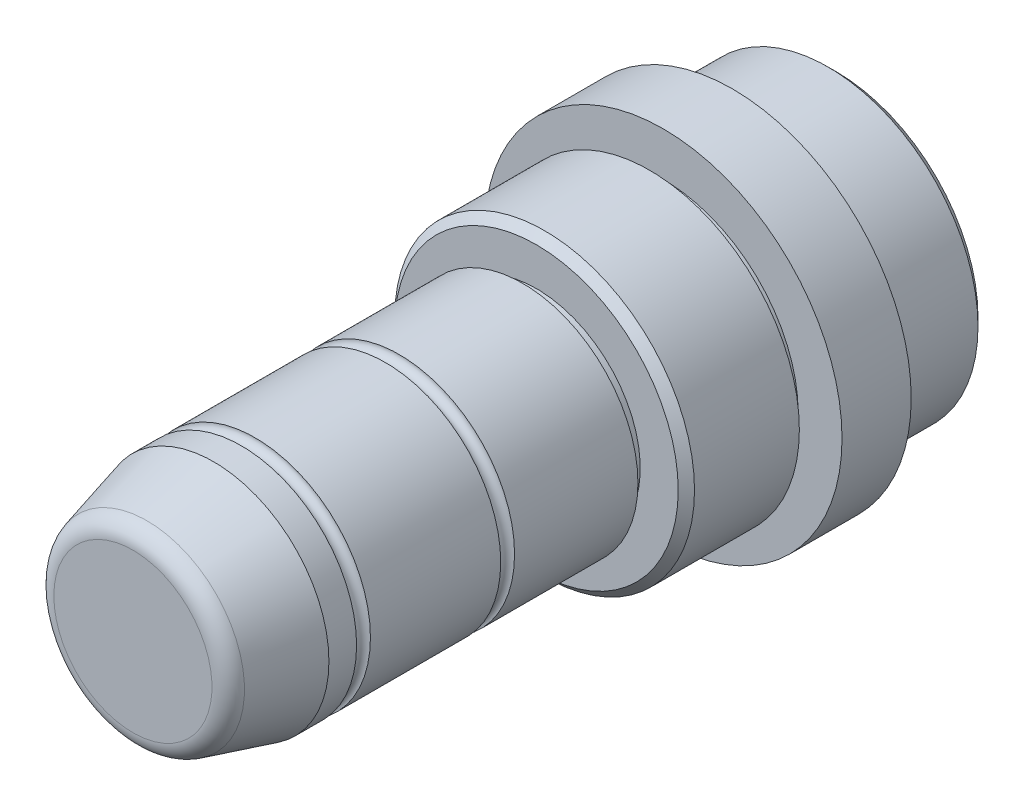
ISO-10303-21;
HEADER;
FILE_DESCRIPTION(('STEP AP214'),'2;1');
FILE_NAME('part.step','',(''),(''),'','','');
FILE_SCHEMA(('AUTOMOTIVE_DESIGN { 1 0 10303 214 1 1 1 1 }'));
ENDSEC;
DATA;
#1=APPLICATION_CONTEXT('core data for automotive mechanical design processes');
#2=APPLICATION_PROTOCOL_DEFINITION('international standard','automotive_design',2000,#1);
#3=PRODUCT_CONTEXT('',#1,'mechanical');
#4=PRODUCT('Part','Part','',(#3));
#5=PRODUCT_RELATED_PRODUCT_CATEGORY('part','',(#4));
#6=PRODUCT_DEFINITION_FORMATION('','',#4);
#7=PRODUCT_DEFINITION_CONTEXT('part definition',#1,'design');
#8=PRODUCT_DEFINITION('design','',#6,#7);
#9=PRODUCT_DEFINITION_SHAPE('','',#8);
#10=(LENGTH_UNIT() NAMED_UNIT(*) SI_UNIT(.MILLI.,.METRE.));
#11=(NAMED_UNIT(*) PLANE_ANGLE_UNIT() SI_UNIT($,.RADIAN.));
#12=(NAMED_UNIT(*) SI_UNIT($,.STERADIAN.) SOLID_ANGLE_UNIT());
#13=UNCERTAINTY_MEASURE_WITH_UNIT(LENGTH_MEASURE(1.E-05),#10,'distance_accuracy_value','');
#14=(GEOMETRIC_REPRESENTATION_CONTEXT(3) GLOBAL_UNCERTAINTY_ASSIGNED_CONTEXT((#13)) GLOBAL_UNIT_ASSIGNED_CONTEXT((#10,
#11,#12)) REPRESENTATION_CONTEXT('',''));
#15=CARTESIAN_POINT('',(0.,0.,0.));
#16=DIRECTION('',(0.,0.,1.));
#17=DIRECTION('',(1.,0.,0.));
#18=AXIS2_PLACEMENT_3D('',#15,#16,#17);
#19=CARTESIAN_POINT('',(0.,0.,59.3500000000015));
#20=DIRECTION('',(0.,0.,-1.));
#21=DIRECTION('',(-1.,0.,0.));
#22=AXIS2_PLACEMENT_3D('',#19,#20,#21);
#23=TOROIDAL_SURFACE('',#22,6.85826612281792,1.64999999999851);
#24=CARTESIAN_POINT('',(0.,0.,61.));
#25=DIRECTION('',(0.,0.,-1.));
#26=DIRECTION('',(-1.,0.,0.));
#27=AXIS2_PLACEMENT_3D('',#24,#25,#26);
#28=CIRCLE('',#27,6.85826612281792);
#29=CARTESIAN_POINT('',(-6.85826612281792,0.,61.));
#30=VERTEX_POINT('',#29);
#31=EDGE_CURVE('E10',#30,#30,#28,.T.);
#32=ORIENTED_EDGE('',*,*,#31,.T.);
#33=EDGE_LOOP('',(#32));
#34=FACE_BOUND('',#33,.T.);
#35=CARTESIAN_POINT('',(0.,0.,59.7770514244203));
#36=DIRECTION('',(0.,0.,-1.));
#37=DIRECTION('',(-1.,0.,0.));
#38=AXIS2_PLACEMENT_3D('',#35,#36,#37);
#39=CIRCLE('',#38,8.45204373619346);
#40=CARTESIAN_POINT('',(-8.45204373619346,0.,59.7770514244203));
#41=VERTEX_POINT('',#40);
#42=EDGE_CURVE('E105',#41,#41,#39,.T.);
#43=ORIENTED_EDGE('',*,*,#42,.F.);
#44=EDGE_LOOP('',(#43));
#45=FACE_BOUND('',#44,.T.);
#46=ADVANCED_FACE('F35',(#34,#45),#23,.T.);
#47=CARTESIAN_POINT('',(6.85826612281792,0.,61.));
#48=DIRECTION('',(0.,0.,1.));
#49=DIRECTION('',(1.,0.,0.));
#50=AXIS2_PLACEMENT_3D('',#47,#48,#49);
#51=PLANE('',#50);
#52=ORIENTED_EDGE('',*,*,#31,.F.);
#53=EDGE_LOOP('',(#52));
#54=FACE_BOUND('',#53,.T.);
#55=ADVANCED_FACE('F113',(#54),#51,.T.);
#56=CARTESIAN_POINT('',(0.,0.,0.));
#57=DIRECTION('',(0.,0.,-1.));
#58=DIRECTION('',(-1.,0.,0.));
#59=AXIS2_PLACEMENT_3D('',#56,#57,#58);
#60=PLANE('',#59);
#61=CARTESIAN_POINT('',(0.,0.,0.));
#62=DIRECTION('',(0.,0.,-1.));
#63=DIRECTION('',(-1.,0.,0.));
#64=AXIS2_PLACEMENT_3D('',#61,#62,#63);
#65=CIRCLE('',#64,12.292893218813);
#66=CARTESIAN_POINT('',(-12.292893218813,0.,0.));
#67=VERTEX_POINT('',#66);
#68=EDGE_CURVE('E41',#67,#67,#65,.T.);
#69=ORIENTED_EDGE('',*,*,#68,.T.);
#70=EDGE_LOOP('',(#69));
#71=FACE_BOUND('',#70,.T.);
#72=ADVANCED_FACE('F117',(#71),#60,.T.);
#73=CARTESIAN_POINT('',(0.,0.,0.));
#74=DIRECTION('',(0.,0.,1.));
#75=DIRECTION('',(1.,0.,0.));
#76=AXIS2_PLACEMENT_3D('',#73,#74,#75);
#77=CONICAL_SURFACE('',#76,12.292893218813,0.785398163397767);
#78=CARTESIAN_POINT('',(0.,0.,0.707106781186552));
#79=DIRECTION('',(0.,0.,-1.));
#80=DIRECTION('',(-1.,0.,0.));
#81=AXIS2_PLACEMENT_3D('',#78,#79,#80);
#82=CIRCLE('',#81,13.);
#83=CARTESIAN_POINT('',(-13.,0.,0.707106781186552));
#84=VERTEX_POINT('',#83);
#85=EDGE_CURVE('E45',#84,#84,#82,.T.);
#86=ORIENTED_EDGE('',*,*,#85,.T.);
#87=EDGE_LOOP('',(#86));
#88=FACE_BOUND('',#87,.T.);
#89=ORIENTED_EDGE('',*,*,#68,.F.);
#90=EDGE_LOOP('',(#89));
#91=FACE_BOUND('',#90,.T.);
#92=ADVANCED_FACE('F122',(#88,#91),#77,.T.);
#93=CARTESIAN_POINT('',(0.,0.,61.0050000000001));
#94=DIRECTION('',(0.,0.,-1.));
#95=DIRECTION('',(-1.,0.,0.));
#96=AXIS2_PLACEMENT_3D('',#93,#94,#95);
#97=CYLINDRICAL_SURFACE('',#96,13.);
#98=CARTESIAN_POINT('',(0.,0.,7.8));
#99=DIRECTION('',(0.,0.,-1.));
#100=DIRECTION('',(-1.,0.,0.));
#101=AXIS2_PLACEMENT_3D('',#98,#99,#100);
#102=CIRCLE('',#101,13.);
#103=CARTESIAN_POINT('',(-13.,0.,7.8));
#104=VERTEX_POINT('',#103);
#105=EDGE_CURVE('E49',#104,#104,#102,.T.);
#106=ORIENTED_EDGE('',*,*,#105,.T.);
#107=EDGE_LOOP('',(#106));
#108=FACE_BOUND('',#107,.T.);
#109=ORIENTED_EDGE('',*,*,#85,.F.);
#110=EDGE_LOOP('',(#109));
#111=FACE_BOUND('',#110,.T.);
#112=ADVANCED_FACE('F127',(#108,#111),#97,.T.);
#113=CARTESIAN_POINT('',(13.,0.,7.8));
#114=DIRECTION('',(0.,0.,1.));
#115=DIRECTION('',(1.,0.,0.));
#116=AXIS2_PLACEMENT_3D('',#113,#114,#115);
#117=PLANE('',#116);
#118=CARTESIAN_POINT('',(0.,0.,7.8));
#119=DIRECTION('',(0.,0.,-1.));
#120=DIRECTION('',(-1.,0.,0.));
#121=AXIS2_PLACEMENT_3D('',#118,#119,#120);
#122=CIRCLE('',#121,11.7);
#123=CARTESIAN_POINT('',(-11.7,0.,7.8));
#124=VERTEX_POINT('',#123);
#125=EDGE_CURVE('E54',#124,#124,#122,.T.);
#126=ORIENTED_EDGE('',*,*,#125,.T.);
#127=EDGE_LOOP('',(#126));
#128=FACE_BOUND('',#127,.T.);
#129=ORIENTED_EDGE('',*,*,#105,.F.);
#130=EDGE_LOOP('',(#129));
#131=FACE_BOUND('',#130,.T.);
#132=ADVANCED_FACE('F131',(#128,#131),#117,.T.);
#133=CARTESIAN_POINT('',(0.,0.,61.0050000000001));
#134=DIRECTION('',(0.,0.,-1.));
#135=DIRECTION('',(-1.,0.,0.));
#136=AXIS2_PLACEMENT_3D('',#133,#134,#135);
#137=CYLINDRICAL_SURFACE('',#136,11.7);
#138=CARTESIAN_POINT('',(0.,0.,9.));
#139=DIRECTION('',(0.,0.,-1.));
#140=DIRECTION('',(-1.,0.,0.));
#141=AXIS2_PLACEMENT_3D('',#138,#139,#140);
#142=CIRCLE('',#141,11.7);
#143=CARTESIAN_POINT('',(-11.7,0.,9.));
#144=VERTEX_POINT('',#143);
#145=EDGE_CURVE('E57',#144,#144,#142,.T.);
#146=ORIENTED_EDGE('',*,*,#145,.T.);
#147=EDGE_LOOP('',(#146));
#148=FACE_BOUND('',#147,.T.);
#149=ORIENTED_EDGE('',*,*,#125,.F.);
#150=EDGE_LOOP('',(#149));
#151=FACE_BOUND('',#150,.T.);
#152=ADVANCED_FACE('F135',(#148,#151),#137,.T.);
#153=CARTESIAN_POINT('',(11.7,0.,9.));
#154=DIRECTION('',(0.,0.,-1.));
#155=DIRECTION('',(-1.,0.,0.));
#156=AXIS2_PLACEMENT_3D('',#153,#154,#155);
#157=PLANE('',#156);
#158=CARTESIAN_POINT('',(0.,0.,9.));
#159=DIRECTION('',(0.,0.,-1.));
#160=DIRECTION('',(-1.,0.,0.));
#161=AXIS2_PLACEMENT_3D('',#158,#159,#160);
#162=CIRCLE('',#161,15.5);
#163=CARTESIAN_POINT('',(-15.5,0.,9.));
#164=VERTEX_POINT('',#163);
#165=EDGE_CURVE('E60',#164,#164,#162,.T.);
#166=ORIENTED_EDGE('',*,*,#165,.T.);
#167=EDGE_LOOP('',(#166));
#168=FACE_BOUND('',#167,.T.);
#169=ORIENTED_EDGE('',*,*,#145,.F.);
#170=EDGE_LOOP('',(#169));
#171=FACE_BOUND('',#170,.T.);
#172=ADVANCED_FACE('F139',(#168,#171),#157,.T.);
#173=CARTESIAN_POINT('',(0.,0.,61.0050000000001));
#174=DIRECTION('',(0.,0.,-1.));
#175=DIRECTION('',(-1.,0.,0.));
#176=AXIS2_PLACEMENT_3D('',#173,#174,#175);
#177=CYLINDRICAL_SURFACE('',#176,15.5);
#178=CARTESIAN_POINT('',(0.,0.,15.));
#179=DIRECTION('',(0.,0.,-1.));
#180=DIRECTION('',(-1.,0.,0.));
#181=AXIS2_PLACEMENT_3D('',#178,#179,#180);
#182=CIRCLE('',#181,15.5);
#183=CARTESIAN_POINT('',(-15.5,0.,15.));
#184=VERTEX_POINT('',#183);
#185=EDGE_CURVE('E63',#184,#184,#182,.T.);
#186=ORIENTED_EDGE('',*,*,#185,.T.);
#187=EDGE_LOOP('',(#186));
#188=FACE_BOUND('',#187,.T.);
#189=ORIENTED_EDGE('',*,*,#165,.F.);
#190=EDGE_LOOP('',(#189));
#191=FACE_BOUND('',#190,.T.);
#192=ADVANCED_FACE('F143',(#188,#191),#177,.T.);
#193=CARTESIAN_POINT('',(15.5,0.,15.));
#194=DIRECTION('',(0.,0.,1.));
#195=DIRECTION('',(1.,0.,0.));
#196=AXIS2_PLACEMENT_3D('',#193,#194,#195);
#197=PLANE('',#196);
#198=CARTESIAN_POINT('',(0.,0.,15.));
#199=DIRECTION('',(0.,0.,-1.));
#200=DIRECTION('',(-1.,0.,0.));
#201=AXIS2_PLACEMENT_3D('',#198,#199,#200);
#202=CIRCLE('',#201,11.7);
#203=CARTESIAN_POINT('',(-11.7,0.,15.));
#204=VERTEX_POINT('',#203);
#205=EDGE_CURVE('E66',#204,#204,#202,.T.);
#206=ORIENTED_EDGE('',*,*,#205,.T.);
#207=EDGE_LOOP('',(#206));
#208=FACE_BOUND('',#207,.T.);
#209=ORIENTED_EDGE('',*,*,#185,.F.);
#210=EDGE_LOOP('',(#209));
#211=FACE_BOUND('',#210,.T.);
#212=ADVANCED_FACE('F147',(#208,#211),#197,.T.);
#213=CARTESIAN_POINT('',(0.,0.,61.0050000000001));
#214=DIRECTION('',(0.,0.,-1.));
#215=DIRECTION('',(-1.,0.,0.));
#216=AXIS2_PLACEMENT_3D('',#213,#214,#215);
#217=CYLINDRICAL_SURFACE('',#216,11.7);
#218=CARTESIAN_POINT('',(0.,0.,16.2));
#219=DIRECTION('',(0.,0.,-1.));
#220=DIRECTION('',(-1.,0.,0.));
#221=AXIS2_PLACEMENT_3D('',#218,#219,#220);
#222=CIRCLE('',#221,11.7);
#223=CARTESIAN_POINT('',(-11.7,0.,16.2));
#224=VERTEX_POINT('',#223);
#225=EDGE_CURVE('E69',#224,#224,#222,.T.);
#226=ORIENTED_EDGE('',*,*,#225,.T.);
#227=EDGE_LOOP('',(#226));
#228=FACE_BOUND('',#227,.T.);
#229=ORIENTED_EDGE('',*,*,#205,.F.);
#230=EDGE_LOOP('',(#229));
#231=FACE_BOUND('',#230,.T.);
#232=ADVANCED_FACE('F151',(#228,#231),#217,.T.);
#233=CARTESIAN_POINT('',(11.7,0.,16.2));
#234=DIRECTION('',(0.,0.,-1.));
#235=DIRECTION('',(-1.,0.,0.));
#236=AXIS2_PLACEMENT_3D('',#233,#234,#235);
#237=PLANE('',#236);
#238=CARTESIAN_POINT('',(0.,0.,16.2));
#239=DIRECTION('',(0.,0.,-1.));
#240=DIRECTION('',(-1.,0.,0.));
#241=AXIS2_PLACEMENT_3D('',#238,#239,#240);
#242=CIRCLE('',#241,13.);
#243=CARTESIAN_POINT('',(-13.,0.,16.2));
#244=VERTEX_POINT('',#243);
#245=EDGE_CURVE('E72',#244,#244,#242,.T.);
#246=ORIENTED_EDGE('',*,*,#245,.T.);
#247=EDGE_LOOP('',(#246));
#248=FACE_BOUND('',#247,.T.);
#249=ORIENTED_EDGE('',*,*,#225,.F.);
#250=EDGE_LOOP('',(#249));
#251=FACE_BOUND('',#250,.T.);
#252=ADVANCED_FACE('F155',(#248,#251),#237,.T.);
#253=CARTESIAN_POINT('',(0.,0.,61.0050000000001));
#254=DIRECTION('',(0.,0.,-1.));
#255=DIRECTION('',(-1.,0.,0.));
#256=AXIS2_PLACEMENT_3D('',#253,#254,#255);
#257=CYLINDRICAL_SURFACE('',#256,13.);
#258=CARTESIAN_POINT('',(0.,0.,25.292893218813));
#259=DIRECTION('',(0.,0.,-1.));
#260=DIRECTION('',(-1.,0.,0.));
#261=AXIS2_PLACEMENT_3D('',#258,#259,#260);
#262=CIRCLE('',#261,13.);
#263=CARTESIAN_POINT('',(-13.,0.,25.292893218813));
#264=VERTEX_POINT('',#263);
#265=EDGE_CURVE('E75',#264,#264,#262,.T.);
#266=ORIENTED_EDGE('',*,*,#265,.T.);
#267=EDGE_LOOP('',(#266));
#268=FACE_BOUND('',#267,.T.);
#269=ORIENTED_EDGE('',*,*,#245,.F.);
#270=EDGE_LOOP('',(#269));
#271=FACE_BOUND('',#270,.T.);
#272=ADVANCED_FACE('F159',(#268,#271),#257,.T.);
#273=CARTESIAN_POINT('',(0.,0.,25.292893218813));
#274=DIRECTION('',(0.,0.,-1.));
#275=DIRECTION('',(-1.,0.,0.));
#276=AXIS2_PLACEMENT_3D('',#273,#274,#275);
#277=CONICAL_SURFACE('',#276,13.,0.785398163397447);
#278=CARTESIAN_POINT('',(0.,0.,26.));
#279=DIRECTION('',(0.,0.,-1.));
#280=DIRECTION('',(-1.,0.,0.));
#281=AXIS2_PLACEMENT_3D('',#278,#279,#280);
#282=CIRCLE('',#281,12.292893218813);
#283=CARTESIAN_POINT('',(-12.292893218813,0.,26.));
#284=VERTEX_POINT('',#283);
#285=EDGE_CURVE('E78',#284,#284,#282,.T.);
#286=ORIENTED_EDGE('',*,*,#285,.T.);
#287=EDGE_LOOP('',(#286));
#288=FACE_BOUND('',#287,.T.);
#289=ORIENTED_EDGE('',*,*,#265,.F.);
#290=EDGE_LOOP('',(#289));
#291=FACE_BOUND('',#290,.T.);
#292=ADVANCED_FACE('F163',(#288,#291),#277,.T.);
#293=CARTESIAN_POINT('',(12.292893218813,0.,26.));
#294=DIRECTION('',(0.,0.,1.));
#295=DIRECTION('',(1.,0.,0.));
#296=AXIS2_PLACEMENT_3D('',#293,#294,#295);
#297=PLANE('',#296);
#298=CARTESIAN_POINT('',(0.,0.,26.));
#299=DIRECTION('',(0.,0.,-1.));
#300=DIRECTION('',(-1.,0.,0.));
#301=AXIS2_PLACEMENT_3D('',#298,#299,#300);
#302=CIRCLE('',#301,9.);
#303=CARTESIAN_POINT('',(-9.,0.,26.));
#304=VERTEX_POINT('',#303);
#305=EDGE_CURVE('E81',#304,#304,#302,.T.);
#306=ORIENTED_EDGE('',*,*,#305,.T.);
#307=EDGE_LOOP('',(#306));
#308=FACE_BOUND('',#307,.T.);
#309=ORIENTED_EDGE('',*,*,#285,.F.);
#310=EDGE_LOOP('',(#309));
#311=FACE_BOUND('',#310,.T.);
#312=ADVANCED_FACE('F167',(#308,#311),#297,.T.);
#313=CARTESIAN_POINT('',(0.,0.,61.0050000000001));
#314=DIRECTION('',(0.,0.,-1.));
#315=DIRECTION('',(-1.,0.,0.));
#316=AXIS2_PLACEMENT_3D('',#313,#314,#315);
#317=CYLINDRICAL_SURFACE('',#316,9.);
#318=CARTESIAN_POINT('',(0.,0.,27.2));
#319=DIRECTION('',(0.,0.,-1.));
#320=DIRECTION('',(-1.,0.,0.));
#321=AXIS2_PLACEMENT_3D('',#318,#319,#320);
#322=CIRCLE('',#321,9.);
#323=CARTESIAN_POINT('',(-9.,0.,27.2));
#324=VERTEX_POINT('',#323);
#325=EDGE_CURVE('E84',#324,#324,#322,.T.);
#326=ORIENTED_EDGE('',*,*,#325,.T.);
#327=EDGE_LOOP('',(#326));
#328=FACE_BOUND('',#327,.T.);
#329=ORIENTED_EDGE('',*,*,#305,.F.);
#330=EDGE_LOOP('',(#329));
#331=FACE_BOUND('',#330,.T.);
#332=ADVANCED_FACE('F171',(#328,#331),#317,.T.);
#333=CARTESIAN_POINT('',(9.,0.,27.2));
#334=DIRECTION('',(0.,0.,-1.));
#335=DIRECTION('',(-1.,0.,0.));
#336=AXIS2_PLACEMENT_3D('',#333,#334,#335);
#337=PLANE('',#336);
#338=CARTESIAN_POINT('',(0.,0.,27.2));
#339=DIRECTION('',(0.,0.,-1.));
#340=DIRECTION('',(-1.,0.,0.));
#341=AXIS2_PLACEMENT_3D('',#338,#339,#340);
#342=CIRCLE('',#341,10.);
#343=CARTESIAN_POINT('',(-10.,0.,27.2));
#344=VERTEX_POINT('',#343);
#345=EDGE_CURVE('E87',#344,#344,#342,.T.);
#346=ORIENTED_EDGE('',*,*,#345,.T.);
#347=EDGE_LOOP('',(#346));
#348=FACE_BOUND('',#347,.T.);
#349=ORIENTED_EDGE('',*,*,#325,.F.);
#350=EDGE_LOOP('',(#349));
#351=FACE_BOUND('',#350,.T.);
#352=ADVANCED_FACE('F175',(#348,#351),#337,.T.);
#353=CARTESIAN_POINT('',(0.,0.,61.0050000000001));
#354=DIRECTION('',(0.,0.,-1.));
#355=DIRECTION('',(-1.,0.,0.));
#356=AXIS2_PLACEMENT_3D('',#353,#354,#355);
#357=CYLINDRICAL_SURFACE('',#356,10.);
#358=CARTESIAN_POINT('',(0.,0.,37.8999999));
#359=DIRECTION('',(0.,0.,-1.));
#360=DIRECTION('',(-1.,0.,0.));
#361=AXIS2_PLACEMENT_3D('',#358,#359,#360);
#362=CIRCLE('',#361,10.);
#363=CARTESIAN_POINT('',(-10.,0.,37.8999999));
#364=VERTEX_POINT('',#363);
#365=EDGE_CURVE('E90',#364,#364,#362,.T.);
#366=ORIENTED_EDGE('',*,*,#365,.T.);
#367=EDGE_LOOP('',(#366));
#368=FACE_BOUND('',#367,.T.);
#369=ORIENTED_EDGE('',*,*,#345,.F.);
#370=EDGE_LOOP('',(#369));
#371=FACE_BOUND('',#370,.T.);
#372=ADVANCED_FACE('F179',(#368,#371),#357,.T.);
#373=CARTESIAN_POINT('',(0.,0.,38.4999999));
#374=DIRECTION('',(0.,0.,-1.));
#375=DIRECTION('',(-1.,0.,0.));
#376=AXIS2_PLACEMENT_3D('',#373,#374,#375);
#377=TOROIDAL_SURFACE('',#376,10.,0.599999999999996);
#378=CARTESIAN_POINT('',(0.,0.,39.0999999));
#379=DIRECTION('',(0.,0.,-1.));
#380=DIRECTION('',(-1.,0.,0.));
#381=AXIS2_PLACEMENT_3D('',#378,#379,#380);
#382=CIRCLE('',#381,10.);
#383=CARTESIAN_POINT('',(-10.,0.,39.0999999));
#384=VERTEX_POINT('',#383);
#385=EDGE_CURVE('E93',#384,#384,#382,.T.);
#386=ORIENTED_EDGE('',*,*,#385,.T.);
#387=EDGE_LOOP('',(#386));
#388=FACE_BOUND('',#387,.T.);
#389=ORIENTED_EDGE('',*,*,#365,.F.);
#390=EDGE_LOOP('',(#389));
#391=FACE_BOUND('',#390,.T.);
#392=ADVANCED_FACE('F183',(#388,#391),#377,.F.);
#393=CARTESIAN_POINT('',(0.,0.,61.0050000000001));
#394=DIRECTION('',(0.,0.,-1.));
#395=DIRECTION('',(-1.,0.,0.));
#396=AXIS2_PLACEMENT_3D('',#393,#394,#395);
#397=CYLINDRICAL_SURFACE('',#396,10.);
#398=CARTESIAN_POINT('',(0.,0.,50.4));
#399=DIRECTION('',(0.,0.,-1.));
#400=DIRECTION('',(-1.,0.,0.));
#401=AXIS2_PLACEMENT_3D('',#398,#399,#400);
#402=CIRCLE('',#401,10.);
#403=CARTESIAN_POINT('',(-10.,0.,50.4));
#404=VERTEX_POINT('',#403);
#405=EDGE_CURVE('E96',#404,#404,#402,.T.);
#406=ORIENTED_EDGE('',*,*,#405,.T.);
#407=EDGE_LOOP('',(#406));
#408=FACE_BOUND('',#407,.T.);
#409=ORIENTED_EDGE('',*,*,#385,.F.);
#410=EDGE_LOOP('',(#409));
#411=FACE_BOUND('',#410,.T.);
#412=ADVANCED_FACE('F187',(#408,#411),#397,.T.);
#413=CARTESIAN_POINT('',(0.,0.,51.));
#414=DIRECTION('',(0.,0.,-1.));
#415=DIRECTION('',(-1.,0.,0.));
#416=AXIS2_PLACEMENT_3D('',#413,#414,#415);
#417=TOROIDAL_SURFACE('',#416,10.,0.600000000000003);
#418=CARTESIAN_POINT('',(0.,0.,51.6));
#419=DIRECTION('',(0.,0.,-1.));
#420=DIRECTION('',(-1.,0.,0.));
#421=AXIS2_PLACEMENT_3D('',#418,#419,#420);
#422=CIRCLE('',#421,10.);
#423=CARTESIAN_POINT('',(-10.,0.,51.6));
#424=VERTEX_POINT('',#423);
#425=EDGE_CURVE('E99',#424,#424,#422,.T.);
#426=ORIENTED_EDGE('',*,*,#425,.T.);
#427=EDGE_LOOP('',(#426));
#428=FACE_BOUND('',#427,.T.);
#429=ORIENTED_EDGE('',*,*,#405,.F.);
#430=EDGE_LOOP('',(#429));
#431=FACE_BOUND('',#430,.T.);
#432=ADVANCED_FACE('F191',(#428,#431),#417,.F.);
#433=CARTESIAN_POINT('',(0.,0.,61.0050000000001));
#434=DIRECTION('',(0.,0.,-1.));
#435=DIRECTION('',(-1.,0.,0.));
#436=AXIS2_PLACEMENT_3D('',#433,#434,#435);
#437=CYLINDRICAL_SURFACE('',#436,10.);
#438=CARTESIAN_POINT('',(0.,0.,54.));
#439=DIRECTION('',(0.,0.,-1.));
#440=DIRECTION('',(-1.,0.,0.));
#441=AXIS2_PLACEMENT_3D('',#438,#439,#440);
#442=CIRCLE('',#441,10.);
#443=CARTESIAN_POINT('',(-10.,0.,54.));
#444=VERTEX_POINT('',#443);
#445=EDGE_CURVE('E102',#444,#444,#442,.T.);
#446=ORIENTED_EDGE('',*,*,#445,.T.);
#447=EDGE_LOOP('',(#446));
#448=FACE_BOUND('',#447,.T.);
#449=ORIENTED_EDGE('',*,*,#425,.F.);
#450=EDGE_LOOP('',(#449));
#451=FACE_BOUND('',#450,.T.);
#452=ADVANCED_FACE('F195',(#448,#451),#437,.T.);
#453=CARTESIAN_POINT('',(0.,0.,54.));
#454=DIRECTION('',(0.,0.,-1.));
#455=DIRECTION('',(-1.,0.,0.));
#456=AXIS2_PLACEMENT_3D('',#453,#454,#455);
#457=CONICAL_SURFACE('',#456,10.,0.261799387799161);
#458=ORIENTED_EDGE('',*,*,#42,.T.);
#459=EDGE_LOOP('',(#458));
#460=FACE_BOUND('',#459,.T.);
#461=ORIENTED_EDGE('',*,*,#445,.F.);
#462=EDGE_LOOP('',(#461));
#463=FACE_BOUND('',#462,.T.);
#464=ADVANCED_FACE('F109',(#460,#463),#457,.T.);
#465=CLOSED_SHELL('',(#46,#55,#72,#92,#112,#132,#152,#172,#192,#212,#232,#252,#272,#292,#312,
#332,#352,#372,#392,#412,#432,#452,#464));
#466=MANIFOLD_SOLID_BREP('B2',#465);
#467=ADVANCED_BREP_SHAPE_REPRESENTATION('',(#18,#466),#14);
#468=SHAPE_DEFINITION_REPRESENTATION(#9,#467);
ENDSEC;
END-ISO-10303-21;
